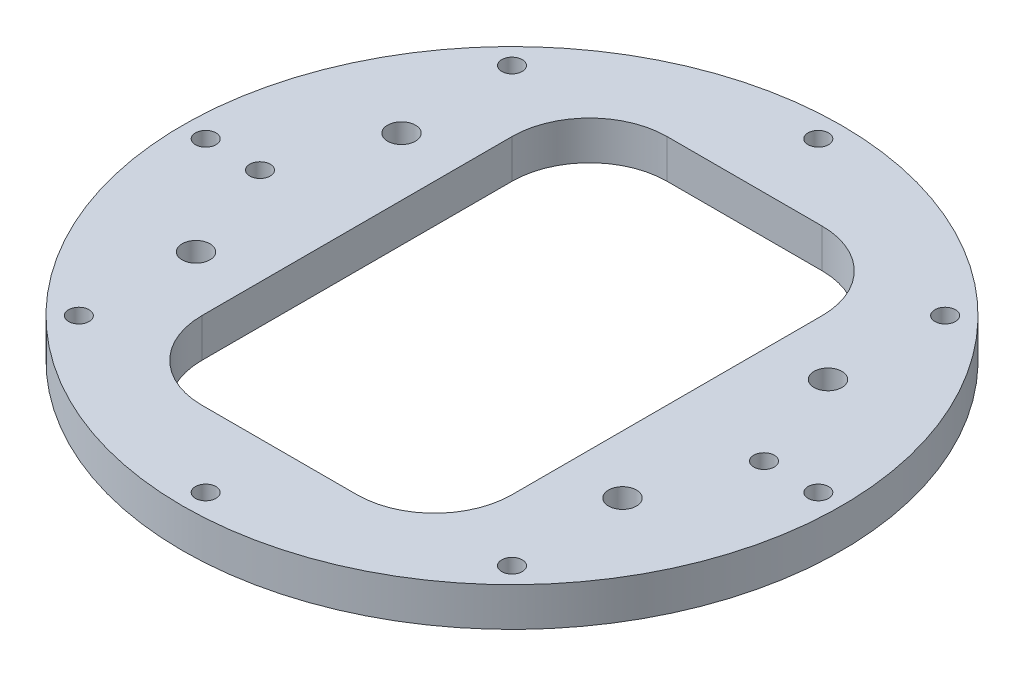
ISO-10303-21;
HEADER;
FILE_DESCRIPTION(('STEP AP214'),'2;1');
FILE_NAME('part.step','',(''),(''),'','','');
FILE_SCHEMA(('AUTOMOTIVE_DESIGN { 1 0 10303 214 1 1 1 1 }'));
ENDSEC;
DATA;
#1=APPLICATION_CONTEXT('core data for automotive mechanical design processes');
#2=APPLICATION_PROTOCOL_DEFINITION('international standard','automotive_design',2000,#1);
#3=PRODUCT_CONTEXT('',#1,'mechanical');
#4=PRODUCT('Part','Part','',(#3));
#5=PRODUCT_RELATED_PRODUCT_CATEGORY('part','',(#4));
#6=PRODUCT_DEFINITION_FORMATION('','',#4);
#7=PRODUCT_DEFINITION_CONTEXT('part definition',#1,'design');
#8=PRODUCT_DEFINITION('design','',#6,#7);
#9=PRODUCT_DEFINITION_SHAPE('','',#8);
#10=(LENGTH_UNIT() NAMED_UNIT(*) SI_UNIT(.MILLI.,.METRE.));
#11=(NAMED_UNIT(*) PLANE_ANGLE_UNIT() SI_UNIT($,.RADIAN.));
#12=(NAMED_UNIT(*) SI_UNIT($,.STERADIAN.) SOLID_ANGLE_UNIT());
#13=UNCERTAINTY_MEASURE_WITH_UNIT(LENGTH_MEASURE(1.E-05),#10,'distance_accuracy_value','');
#14=(GEOMETRIC_REPRESENTATION_CONTEXT(3) GLOBAL_UNCERTAINTY_ASSIGNED_CONTEXT((#13)) GLOBAL_UNIT_ASSIGNED_CONTEXT((#10,
#11,#12)) REPRESENTATION_CONTEXT('',''));
#15=CARTESIAN_POINT('',(0.,0.,0.));
#16=DIRECTION('',(0.,0.,1.));
#17=DIRECTION('',(1.,0.,0.));
#18=AXIS2_PLACEMENT_3D('',#15,#16,#17);
#19=CARTESIAN_POINT('',(0.,10.,0.));
#20=DIRECTION('',(0.,1.,0.));
#21=DIRECTION('',(0.,0.,1.));
#22=AXIS2_PLACEMENT_3D('',#19,#20,#21);
#23=PLANE('',#22);
#24=CARTESIAN_POINT('',(-55.,10.,26.5));
#25=DIRECTION('',(0.,1.,0.));
#26=DIRECTION('',(0.,0.,1.));
#27=AXIS2_PLACEMENT_3D('',#24,#25,#26);
#28=CIRCLE('',#27,3.6);
#29=CARTESIAN_POINT('',(-55.,10.,30.1));
#30=VERTEX_POINT('',#29);
#31=EDGE_CURVE('E273',#30,#30,#28,.T.);
#32=ORIENTED_EDGE('',*,*,#31,.F.);
#33=EDGE_LOOP('',(#32));
#34=FACE_BOUND('',#33,.T.);
#35=CARTESIAN_POINT('',(55.,10.,-26.5));
#36=DIRECTION('',(0.,1.,0.));
#37=DIRECTION('',(0.,0.,1.));
#38=AXIS2_PLACEMENT_3D('',#35,#36,#37);
#39=CIRCLE('',#38,3.6);
#40=CARTESIAN_POINT('',(55.,10.,-22.9));
#41=VERTEX_POINT('',#40);
#42=EDGE_CURVE('E297',#41,#41,#39,.T.);
#43=ORIENTED_EDGE('',*,*,#42,.F.);
#44=EDGE_LOOP('',(#43));
#45=FACE_BOUND('',#44,.T.);
#46=CARTESIAN_POINT('',(65.,10.,0.));
#47=DIRECTION('',(0.,1.,0.));
#48=DIRECTION('',(0.,0.,1.));
#49=AXIS2_PLACEMENT_3D('',#46,#47,#48);
#50=CIRCLE('',#49,2.65);
#51=CARTESIAN_POINT('',(65.,10.,2.65));
#52=VERTEX_POINT('',#51);
#53=EDGE_CURVE('E287',#52,#52,#50,.T.);
#54=ORIENTED_EDGE('',*,*,#53,.F.);
#55=EDGE_LOOP('',(#54));
#56=FACE_BOUND('',#55,.T.);
#57=CARTESIAN_POINT('',(55.8614357137374,10.,-55.8614357137372));
#58=DIRECTION('',(0.,1.,0.));
#59=DIRECTION('',(0.,0.,1.));
#60=AXIS2_PLACEMENT_3D('',#57,#58,#59);
#61=CIRCLE('',#60,2.65);
#62=CARTESIAN_POINT('',(55.8614357137374,10.,-53.2114357137371));
#63=VERTEX_POINT('',#62);
#64=EDGE_CURVE('E142',#63,#63,#61,.T.);
#65=ORIENTED_EDGE('',*,*,#64,.F.);
#66=EDGE_LOOP('',(#65));
#67=FACE_BOUND('',#66,.T.);
#68=CARTESIAN_POINT('',(79.,10.,2.75827025768607E-13));
#69=DIRECTION('',(0.,1.,0.));
#70=DIRECTION('',(0.,0.,1.));
#71=AXIS2_PLACEMENT_3D('',#68,#69,#70);
#72=CIRCLE('',#71,2.65);
#73=CARTESIAN_POINT('',(79.,10.,2.65000000000027));
#74=VERTEX_POINT('',#73);
#75=EDGE_CURVE('E235',#74,#74,#72,.T.);
#76=ORIENTED_EDGE('',*,*,#75,.F.);
#77=EDGE_LOOP('',(#76));
#78=FACE_BOUND('',#77,.T.);
#79=CARTESIAN_POINT('',(55.861435713737,10.,55.8614357137375));
#80=DIRECTION('',(0.,1.,0.));
#81=DIRECTION('',(0.,0.,1.));
#82=AXIS2_PLACEMENT_3D('',#79,#80,#81);
#83=CIRCLE('',#82,2.65);
#84=CARTESIAN_POINT('',(55.861435713737,10.,58.5114357137375));
#85=VERTEX_POINT('',#84);
#86=EDGE_CURVE('E232',#85,#85,#83,.T.);
#87=ORIENTED_EDGE('',*,*,#86,.F.);
#88=EDGE_LOOP('',(#87));
#89=FACE_BOUND('',#88,.T.);
#90=CARTESIAN_POINT('',(-5.51654051537215E-13,10.,79.));
#91=DIRECTION('',(0.,1.,0.));
#92=DIRECTION('',(0.,0.,1.));
#93=AXIS2_PLACEMENT_3D('',#90,#91,#92);
#94=CIRCLE('',#93,2.65);
#95=CARTESIAN_POINT('',(-5.51654051537215E-13,10.,81.65));
#96=VERTEX_POINT('',#95);
#97=EDGE_CURVE('E229',#96,#96,#94,.T.);
#98=ORIENTED_EDGE('',*,*,#97,.F.);
#99=EDGE_LOOP('',(#98));
#100=FACE_BOUND('',#99,.T.);
#101=CARTESIAN_POINT('',(-55.8614357137377,10.,55.8614357137368));
#102=DIRECTION('',(0.,1.,0.));
#103=DIRECTION('',(0.,0.,1.));
#104=AXIS2_PLACEMENT_3D('',#101,#102,#103);
#105=CIRCLE('',#104,2.65);
#106=CARTESIAN_POINT('',(-55.8614357137377,10.,58.5114357137368));
#107=VERTEX_POINT('',#106);
#108=EDGE_CURVE('E226',#107,#107,#105,.T.);
#109=ORIENTED_EDGE('',*,*,#108,.F.);
#110=EDGE_LOOP('',(#109));
#111=FACE_BOUND('',#110,.T.);
#112=CARTESIAN_POINT('',(-79.,10.,-8.27481077305822E-13));
#113=DIRECTION('',(0.,1.,0.));
#114=DIRECTION('',(0.,0.,1.));
#115=AXIS2_PLACEMENT_3D('',#112,#113,#114);
#116=CIRCLE('',#115,2.65);
#117=CARTESIAN_POINT('',(-79.,10.,2.64999999999917));
#118=VERTEX_POINT('',#117);
#119=EDGE_CURVE('E223',#118,#118,#116,.T.);
#120=ORIENTED_EDGE('',*,*,#119,.F.);
#121=EDGE_LOOP('',(#120));
#122=FACE_BOUND('',#121,.T.);
#123=CARTESIAN_POINT('',(-55.8614357137366,10.,-55.8614357137379));
#124=DIRECTION('',(0.,1.,0.));
#125=DIRECTION('',(0.,0.,1.));
#126=AXIS2_PLACEMENT_3D('',#123,#124,#125);
#127=CIRCLE('',#126,2.65);
#128=CARTESIAN_POINT('',(-55.8614357137366,10.,-53.2114357137379));
#129=VERTEX_POINT('',#128);
#130=EDGE_CURVE('E220',#129,#129,#127,.T.);
#131=ORIENTED_EDGE('',*,*,#130,.F.);
#132=EDGE_LOOP('',(#131));
#133=FACE_BOUND('',#132,.T.);
#134=CARTESIAN_POINT('',(0.,10.,-79.));
#135=DIRECTION('',(0.,1.,0.));
#136=DIRECTION('',(0.,0.,1.));
#137=AXIS2_PLACEMENT_3D('',#134,#135,#136);
#138=CIRCLE('',#137,2.65);
#139=CARTESIAN_POINT('',(0.,10.,-76.35));
#140=VERTEX_POINT('',#139);
#141=EDGE_CURVE('E212',#140,#140,#138,.T.);
#142=ORIENTED_EDGE('',*,*,#141,.F.);
#143=EDGE_LOOP('',(#142));
#144=FACE_BOUND('',#143,.T.);
#145=CARTESIAN_POINT('',(55.,10.,26.5));
#146=DIRECTION('',(0.,1.,0.));
#147=DIRECTION('',(0.,0.,1.));
#148=AXIS2_PLACEMENT_3D('',#145,#146,#147);
#149=CIRCLE('',#148,3.6);
#150=CARTESIAN_POINT('',(55.,10.,30.1));
#151=VERTEX_POINT('',#150);
#152=EDGE_CURVE('E264',#151,#151,#149,.F.);
#153=ORIENTED_EDGE('',*,*,#152,.T.);
#154=EDGE_LOOP('',(#153));
#155=FACE_BOUND('',#154,.T.);
#156=CARTESIAN_POINT('',(-55.,10.,-26.5));
#157=DIRECTION('',(0.,-1.,0.));
#158=DIRECTION('',(0.,0.,-1.));
#159=AXIS2_PLACEMENT_3D('',#156,#157,#158);
#160=CIRCLE('',#159,3.60000000000002);
#161=CARTESIAN_POINT('',(-55.,10.,-30.1));
#162=VERTEX_POINT('',#161);
#163=EDGE_CURVE('E268',#162,#162,#160,.T.);
#164=ORIENTED_EDGE('',*,*,#163,.T.);
#165=EDGE_LOOP('',(#164));
#166=FACE_BOUND('',#165,.T.);
#167=CARTESIAN_POINT('',(-65.,10.,4.44089209850063E-13));
#168=DIRECTION('',(0.,1.,0.));
#169=DIRECTION('',(0.,0.,1.));
#170=AXIS2_PLACEMENT_3D('',#167,#168,#169);
#171=CIRCLE('',#170,2.65);
#172=CARTESIAN_POINT('',(-65.,10.,2.65000000000044));
#173=VERTEX_POINT('',#172);
#174=EDGE_CURVE('E271',#173,#173,#171,.F.);
#175=ORIENTED_EDGE('',*,*,#174,.T.);
#176=EDGE_LOOP('',(#175));
#177=FACE_BOUND('',#176,.T.);
#178=DIRECTION('',(0.,0.,-1.));
#179=VECTOR('',#178,1.);
#180=CARTESIAN_POINT('',(40.,10.,0.));
#181=LINE('',#180,#179);
#182=CARTESIAN_POINT('',(40.,10.,40.));
#183=VERTEX_POINT('',#182);
#184=CARTESIAN_POINT('',(40.,10.,-40.));
#185=VERTEX_POINT('',#184);
#186=EDGE_CURVE('E208',#183,#185,#181,.T.);
#187=ORIENTED_EDGE('',*,*,#186,.F.);
#188=CARTESIAN_POINT('',(20.,10.,40.));
#189=DIRECTION('',(0.,1.,0.));
#190=DIRECTION('',(0.,0.,1.));
#191=AXIS2_PLACEMENT_3D('',#188,#189,#190);
#192=CIRCLE('',#191,20.);
#193=CARTESIAN_POINT('',(20.,10.,60.));
#194=VERTEX_POINT('',#193);
#195=EDGE_CURVE('E123',#183,#194,#192,.F.);
#196=ORIENTED_EDGE('',*,*,#195,.T.);
#197=DIRECTION('',(1.,0.,0.));
#198=VECTOR('',#197,1.);
#199=CARTESIAN_POINT('',(-40.,10.,60.));
#200=LINE('',#199,#198);
#201=CARTESIAN_POINT('',(-20.,10.,60.));
#202=VERTEX_POINT('',#201);
#203=EDGE_CURVE('E173',#202,#194,#200,.T.);
#204=ORIENTED_EDGE('',*,*,#203,.F.);
#205=CARTESIAN_POINT('',(-20.,10.,40.));
#206=DIRECTION('',(0.,1.,0.));
#207=DIRECTION('',(0.,0.,1.));
#208=AXIS2_PLACEMENT_3D('',#205,#206,#207);
#209=CIRCLE('',#208,20.);
#210=CARTESIAN_POINT('',(-40.,10.,40.));
#211=VERTEX_POINT('',#210);
#212=EDGE_CURVE('E122',#202,#211,#209,.F.);
#213=ORIENTED_EDGE('',*,*,#212,.T.);
#214=DIRECTION('',(0.,0.,-1.));
#215=VECTOR('',#214,1.);
#216=CARTESIAN_POINT('',(-40.,10.,0.));
#217=LINE('',#216,#215);
#218=CARTESIAN_POINT('',(-40.,10.,-40.));
#219=VERTEX_POINT('',#218);
#220=EDGE_CURVE('E168',#211,#219,#217,.T.);
#221=ORIENTED_EDGE('',*,*,#220,.T.);
#222=CARTESIAN_POINT('',(-20.,10.,-40.));
#223=DIRECTION('',(0.,1.,0.));
#224=DIRECTION('',(0.,0.,1.));
#225=AXIS2_PLACEMENT_3D('',#222,#223,#224);
#226=CIRCLE('',#225,20.);
#227=CARTESIAN_POINT('',(-20.,10.,-60.));
#228=VERTEX_POINT('',#227);
#229=EDGE_CURVE('E54',#219,#228,#226,.F.);
#230=ORIENTED_EDGE('',*,*,#229,.T.);
#231=DIRECTION('',(-1.,0.,0.));
#232=VECTOR('',#231,1.);
#233=CARTESIAN_POINT('',(-40.,10.,-60.));
#234=LINE('',#233,#232);
#235=CARTESIAN_POINT('',(20.,10.,-60.));
#236=VERTEX_POINT('',#235);
#237=EDGE_CURVE('E166',#236,#228,#234,.T.);
#238=ORIENTED_EDGE('',*,*,#237,.F.);
#239=CARTESIAN_POINT('',(20.,10.,-40.));
#240=DIRECTION('',(0.,1.,0.));
#241=DIRECTION('',(0.,0.,1.));
#242=AXIS2_PLACEMENT_3D('',#239,#240,#241);
#243=CIRCLE('',#242,20.);
#244=EDGE_CURVE('E160',#236,#185,#243,.F.);
#245=ORIENTED_EDGE('',*,*,#244,.T.);
#246=EDGE_LOOP('',(#187,#196,#204,#213,#221,#230,#238,#245));
#247=FACE_BOUND('',#246,.T.);
#248=CARTESIAN_POINT('',(0.,10.,0.));
#249=DIRECTION('',(0.,1.,0.));
#250=DIRECTION('',(0.,0.,1.));
#251=AXIS2_PLACEMENT_3D('',#248,#249,#250);
#252=CIRCLE('',#251,85.);
#253=CARTESIAN_POINT('',(0.,10.,85.));
#254=VERTEX_POINT('',#253);
#255=EDGE_CURVE('E380',#254,#254,#252,.T.);
#256=ORIENTED_EDGE('',*,*,#255,.T.);
#257=EDGE_LOOP('',(#256));
#258=FACE_BOUND('',#257,.T.);
#259=ADVANCED_FACE('F46',(#34,#45,#56,#67,#78,#89,#100,#111,#122,#133,#144,#155,#166,#177,#247,
#258),#23,.T.);
#260=CARTESIAN_POINT('',(0.,0.,0.));
#261=DIRECTION('',(0.,1.,0.));
#262=DIRECTION('',(0.,0.,1.));
#263=AXIS2_PLACEMENT_3D('',#260,#261,#262);
#264=PLANE('',#263);
#265=CARTESIAN_POINT('',(-55.,0.,26.5));
#266=DIRECTION('',(0.,1.,0.));
#267=DIRECTION('',(0.,0.,1.));
#268=AXIS2_PLACEMENT_3D('',#265,#266,#267);
#269=CIRCLE('',#268,3.6);
#270=CARTESIAN_POINT('',(-55.,0.,30.1));
#271=VERTEX_POINT('',#270);
#272=EDGE_CURVE('E278',#271,#271,#269,.T.);
#273=ORIENTED_EDGE('',*,*,#272,.T.);
#274=EDGE_LOOP('',(#273));
#275=FACE_BOUND('',#274,.T.);
#276=CARTESIAN_POINT('',(65.,0.,0.));
#277=DIRECTION('',(0.,1.,0.));
#278=DIRECTION('',(0.,0.,1.));
#279=AXIS2_PLACEMENT_3D('',#276,#277,#278);
#280=CIRCLE('',#279,2.65);
#281=CARTESIAN_POINT('',(65.,0.,2.65));
#282=VERTEX_POINT('',#281);
#283=EDGE_CURVE('E290',#282,#282,#280,.T.);
#284=ORIENTED_EDGE('',*,*,#283,.T.);
#285=EDGE_LOOP('',(#284));
#286=FACE_BOUND('',#285,.T.);
#287=CARTESIAN_POINT('',(55.,0.,26.5));
#288=DIRECTION('',(0.,1.,0.));
#289=DIRECTION('',(0.,0.,1.));
#290=AXIS2_PLACEMENT_3D('',#287,#288,#289);
#291=CIRCLE('',#290,3.6);
#292=CARTESIAN_POINT('',(55.,0.,30.1));
#293=VERTEX_POINT('',#292);
#294=EDGE_CURVE('E283',#293,#293,#291,.F.);
#295=ORIENTED_EDGE('',*,*,#294,.F.);
#296=EDGE_LOOP('',(#295));
#297=FACE_BOUND('',#296,.T.);
#298=CARTESIAN_POINT('',(0.,0.,-79.));
#299=DIRECTION('',(0.,1.,0.));
#300=DIRECTION('',(0.,0.,1.));
#301=AXIS2_PLACEMENT_3D('',#298,#299,#300);
#302=CIRCLE('',#301,2.65);
#303=CARTESIAN_POINT('',(0.,0.,-76.35));
#304=VERTEX_POINT('',#303);
#305=EDGE_CURVE('E183',#304,#304,#302,.T.);
#306=ORIENTED_EDGE('',*,*,#305,.T.);
#307=EDGE_LOOP('',(#306));
#308=FACE_BOUND('',#307,.T.);
#309=CARTESIAN_POINT('',(-55.8614357137366,0.,-55.8614357137379));
#310=DIRECTION('',(0.,1.,0.));
#311=DIRECTION('',(0.,0.,1.));
#312=AXIS2_PLACEMENT_3D('',#309,#310,#311);
#313=CIRCLE('',#312,2.65);
#314=CARTESIAN_POINT('',(-55.8614357137366,0.,-53.2114357137379));
#315=VERTEX_POINT('',#314);
#316=EDGE_CURVE('E186',#315,#315,#313,.T.);
#317=ORIENTED_EDGE('',*,*,#316,.T.);
#318=EDGE_LOOP('',(#317));
#319=FACE_BOUND('',#318,.T.);
#320=CARTESIAN_POINT('',(-79.,0.,-8.27481077305822E-13));
#321=DIRECTION('',(0.,1.,0.));
#322=DIRECTION('',(0.,0.,1.));
#323=AXIS2_PLACEMENT_3D('',#320,#321,#322);
#324=CIRCLE('',#323,2.65);
#325=CARTESIAN_POINT('',(-79.,0.,2.64999999999917));
#326=VERTEX_POINT('',#325);
#327=EDGE_CURVE('E192',#326,#326,#324,.T.);
#328=ORIENTED_EDGE('',*,*,#327,.T.);
#329=EDGE_LOOP('',(#328));
#330=FACE_BOUND('',#329,.T.);
#331=CARTESIAN_POINT('',(-55.8614357137377,0.,55.8614357137368));
#332=DIRECTION('',(0.,1.,0.));
#333=DIRECTION('',(0.,0.,1.));
#334=AXIS2_PLACEMENT_3D('',#331,#332,#333);
#335=CIRCLE('',#334,2.65);
#336=CARTESIAN_POINT('',(-55.8614357137377,0.,58.5114357137368));
#337=VERTEX_POINT('',#336);
#338=EDGE_CURVE('E195',#337,#337,#335,.T.);
#339=ORIENTED_EDGE('',*,*,#338,.T.);
#340=EDGE_LOOP('',(#339));
#341=FACE_BOUND('',#340,.T.);
#342=CARTESIAN_POINT('',(-5.51654051537215E-13,0.,79.));
#343=DIRECTION('',(0.,1.,0.));
#344=DIRECTION('',(0.,0.,1.));
#345=AXIS2_PLACEMENT_3D('',#342,#343,#344);
#346=CIRCLE('',#345,2.65);
#347=CARTESIAN_POINT('',(-5.51654051537215E-13,0.,81.65));
#348=VERTEX_POINT('',#347);
#349=EDGE_CURVE('E198',#348,#348,#346,.T.);
#350=ORIENTED_EDGE('',*,*,#349,.T.);
#351=EDGE_LOOP('',(#350));
#352=FACE_BOUND('',#351,.T.);
#353=CARTESIAN_POINT('',(55.861435713737,0.,55.8614357137375));
#354=DIRECTION('',(0.,1.,0.));
#355=DIRECTION('',(0.,0.,1.));
#356=AXIS2_PLACEMENT_3D('',#353,#354,#355);
#357=CIRCLE('',#356,2.65);
#358=CARTESIAN_POINT('',(55.861435713737,0.,58.5114357137375));
#359=VERTEX_POINT('',#358);
#360=EDGE_CURVE('E201',#359,#359,#357,.T.);
#361=ORIENTED_EDGE('',*,*,#360,.T.);
#362=EDGE_LOOP('',(#361));
#363=FACE_BOUND('',#362,.T.);
#364=CARTESIAN_POINT('',(79.,0.,2.75827025768607E-13));
#365=DIRECTION('',(0.,1.,0.));
#366=DIRECTION('',(0.,0.,1.));
#367=AXIS2_PLACEMENT_3D('',#364,#365,#366);
#368=CIRCLE('',#367,2.65);
#369=CARTESIAN_POINT('',(79.,0.,2.65000000000027));
#370=VERTEX_POINT('',#369);
#371=EDGE_CURVE('E204',#370,#370,#368,.T.);
#372=ORIENTED_EDGE('',*,*,#371,.T.);
#373=EDGE_LOOP('',(#372));
#374=FACE_BOUND('',#373,.T.);
#375=CARTESIAN_POINT('',(55.8614357137374,0.,-55.8614357137372));
#376=DIRECTION('',(0.,1.,0.));
#377=DIRECTION('',(0.,0.,1.));
#378=AXIS2_PLACEMENT_3D('',#375,#376,#377);
#379=CIRCLE('',#378,2.65);
#380=CARTESIAN_POINT('',(55.8614357137374,0.,-53.2114357137371));
#381=VERTEX_POINT('',#380);
#382=EDGE_CURVE('E206',#381,#381,#379,.T.);
#383=ORIENTED_EDGE('',*,*,#382,.T.);
#384=EDGE_LOOP('',(#383));
#385=FACE_BOUND('',#384,.T.);
#386=CARTESIAN_POINT('',(55.,0.,-26.5));
#387=DIRECTION('',(0.,1.,0.));
#388=DIRECTION('',(0.,0.,1.));
#389=AXIS2_PLACEMENT_3D('',#386,#387,#388);
#390=CIRCLE('',#389,3.6);
#391=CARTESIAN_POINT('',(55.,0.,-22.9));
#392=VERTEX_POINT('',#391);
#393=EDGE_CURVE('E215',#392,#392,#390,.T.);
#394=ORIENTED_EDGE('',*,*,#393,.T.);
#395=EDGE_LOOP('',(#394));
#396=FACE_BOUND('',#395,.T.);
#397=CARTESIAN_POINT('',(-55.,0.,-26.5));
#398=DIRECTION('',(0.,-1.,0.));
#399=DIRECTION('',(0.,0.,-1.));
#400=AXIS2_PLACEMENT_3D('',#397,#398,#399);
#401=CIRCLE('',#400,3.60000000000002);
#402=CARTESIAN_POINT('',(-55.,0.,-30.1));
#403=VERTEX_POINT('',#402);
#404=EDGE_CURVE('E284',#403,#403,#401,.T.);
#405=ORIENTED_EDGE('',*,*,#404,.F.);
#406=EDGE_LOOP('',(#405));
#407=FACE_BOUND('',#406,.T.);
#408=CARTESIAN_POINT('',(-65.,0.,4.44089209850063E-13));
#409=DIRECTION('',(0.,1.,0.));
#410=DIRECTION('',(0.,0.,1.));
#411=AXIS2_PLACEMENT_3D('',#408,#409,#410);
#412=CIRCLE('',#411,2.65);
#413=CARTESIAN_POINT('',(-65.,0.,2.65000000000044));
#414=VERTEX_POINT('',#413);
#415=EDGE_CURVE('E134',#414,#414,#412,.F.);
#416=ORIENTED_EDGE('',*,*,#415,.F.);
#417=EDGE_LOOP('',(#416));
#418=FACE_BOUND('',#417,.T.);
#419=DIRECTION('',(0.,0.,-1.));
#420=VECTOR('',#419,1.);
#421=CARTESIAN_POINT('',(-40.,0.,0.));
#422=LINE('',#421,#420);
#423=CARTESIAN_POINT('',(-40.,0.,40.));
#424=VERTEX_POINT('',#423);
#425=CARTESIAN_POINT('',(-40.,0.,-40.));
#426=VERTEX_POINT('',#425);
#427=EDGE_CURVE('E133',#424,#426,#422,.T.);
#428=ORIENTED_EDGE('',*,*,#427,.F.);
#429=CARTESIAN_POINT('',(-20.,0.,40.));
#430=DIRECTION('',(0.,1.,0.));
#431=DIRECTION('',(0.,0.,1.));
#432=AXIS2_PLACEMENT_3D('',#429,#430,#431);
#433=CIRCLE('',#432,20.);
#434=CARTESIAN_POINT('',(-20.,0.,60.));
#435=VERTEX_POINT('',#434);
#436=EDGE_CURVE('E158',#424,#435,#433,.T.);
#437=ORIENTED_EDGE('',*,*,#436,.T.);
#438=DIRECTION('',(1.,0.,0.));
#439=VECTOR('',#438,1.);
#440=CARTESIAN_POINT('',(-40.,0.,60.));
#441=LINE('',#440,#439);
#442=CARTESIAN_POINT('',(20.,0.,60.));
#443=VERTEX_POINT('',#442);
#444=EDGE_CURVE('E118',#435,#443,#441,.T.);
#445=ORIENTED_EDGE('',*,*,#444,.T.);
#446=CARTESIAN_POINT('',(20.,0.,40.));
#447=DIRECTION('',(0.,1.,0.));
#448=DIRECTION('',(0.,0.,1.));
#449=AXIS2_PLACEMENT_3D('',#446,#447,#448);
#450=CIRCLE('',#449,20.);
#451=CARTESIAN_POINT('',(40.,0.,40.));
#452=VERTEX_POINT('',#451);
#453=EDGE_CURVE('E111',#443,#452,#450,.T.);
#454=ORIENTED_EDGE('',*,*,#453,.T.);
#455=DIRECTION('',(0.,0.,-1.));
#456=VECTOR('',#455,1.);
#457=CARTESIAN_POINT('',(40.,0.,0.));
#458=LINE('',#457,#456);
#459=CARTESIAN_POINT('',(40.,0.,-40.));
#460=VERTEX_POINT('',#459);
#461=EDGE_CURVE('E116',#452,#460,#458,.T.);
#462=ORIENTED_EDGE('',*,*,#461,.T.);
#463=CARTESIAN_POINT('',(20.,0.,-40.));
#464=DIRECTION('',(0.,1.,0.));
#465=DIRECTION('',(0.,0.,1.));
#466=AXIS2_PLACEMENT_3D('',#463,#464,#465);
#467=CIRCLE('',#466,20.);
#468=CARTESIAN_POINT('',(20.,0.,-60.));
#469=VERTEX_POINT('',#468);
#470=EDGE_CURVE('E68',#460,#469,#467,.T.);
#471=ORIENTED_EDGE('',*,*,#470,.T.);
#472=DIRECTION('',(-1.,0.,0.));
#473=VECTOR('',#472,1.);
#474=CARTESIAN_POINT('',(-40.,0.,-60.));
#475=LINE('',#474,#473);
#476=CARTESIAN_POINT('',(-20.,0.,-60.));
#477=VERTEX_POINT('',#476);
#478=EDGE_CURVE('E179',#469,#477,#475,.T.);
#479=ORIENTED_EDGE('',*,*,#478,.T.);
#480=CARTESIAN_POINT('',(-20.,0.,-40.));
#481=DIRECTION('',(0.,1.,0.));
#482=DIRECTION('',(0.,0.,1.));
#483=AXIS2_PLACEMENT_3D('',#480,#481,#482);
#484=CIRCLE('',#483,20.);
#485=EDGE_CURVE('E11',#477,#426,#484,.T.);
#486=ORIENTED_EDGE('',*,*,#485,.T.);
#487=EDGE_LOOP('',(#428,#437,#445,#454,#462,#471,#479,#486));
#488=FACE_BOUND('',#487,.T.);
#489=CARTESIAN_POINT('',(0.,0.,0.));
#490=DIRECTION('',(0.,1.,0.));
#491=DIRECTION('',(0.,0.,1.));
#492=AXIS2_PLACEMENT_3D('',#489,#490,#491);
#493=CIRCLE('',#492,85.);
#494=CARTESIAN_POINT('',(0.,0.,85.));
#495=VERTEX_POINT('',#494);
#496=EDGE_CURVE('E174',#495,#495,#493,.T.);
#497=ORIENTED_EDGE('',*,*,#496,.F.);
#498=EDGE_LOOP('',(#497));
#499=FACE_BOUND('',#498,.T.);
#500=ADVANCED_FACE('F114',(#275,#286,#297,#308,#319,#330,#341,#352,#363,#374,#385,#396,#407,
#418,#488,#499),#264,.F.);
#501=CARTESIAN_POINT('',(40.,10.,0.));
#502=DIRECTION('',(-1.,0.,0.));
#503=DIRECTION('',(0.,0.,1.));
#504=AXIS2_PLACEMENT_3D('',#501,#502,#503);
#505=PLANE('',#504);
#506=ORIENTED_EDGE('',*,*,#461,.F.);
#507=DIRECTION('',(0.,1.,0.));
#508=VECTOR('',#507,1.);
#509=CARTESIAN_POINT('',(40.,10.,40.));
#510=LINE('',#509,#508);
#511=EDGE_CURVE('E129',#452,#183,#510,.T.);
#512=ORIENTED_EDGE('',*,*,#511,.T.);
#513=ORIENTED_EDGE('',*,*,#186,.T.);
#514=DIRECTION('',(0.,1.,0.));
#515=VECTOR('',#514,1.);
#516=CARTESIAN_POINT('',(40.,10.,-40.));
#517=LINE('',#516,#515);
#518=EDGE_CURVE('E132',#185,#460,#517,.F.);
#519=ORIENTED_EDGE('',*,*,#518,.T.);
#520=EDGE_LOOP('',(#506,#512,#513,#519));
#521=FACE_BOUND('',#520,.T.);
#522=ADVANCED_FACE('F127',(#521),#505,.T.);
#523=CARTESIAN_POINT('',(-40.,10.,0.));
#524=DIRECTION('',(-1.,0.,0.));
#525=DIRECTION('',(0.,0.,1.));
#526=AXIS2_PLACEMENT_3D('',#523,#524,#525);
#527=PLANE('',#526);
#528=ORIENTED_EDGE('',*,*,#220,.F.);
#529=DIRECTION('',(0.,1.,0.));
#530=VECTOR('',#529,1.);
#531=CARTESIAN_POINT('',(-40.,0.,40.));
#532=LINE('',#531,#530);
#533=EDGE_CURVE('E150',#211,#424,#532,.F.);
#534=ORIENTED_EDGE('',*,*,#533,.T.);
#535=ORIENTED_EDGE('',*,*,#427,.T.);
#536=DIRECTION('',(0.,1.,0.));
#537=VECTOR('',#536,1.);
#538=CARTESIAN_POINT('',(-40.,10.,-40.));
#539=LINE('',#538,#537);
#540=EDGE_CURVE('E147',#426,#219,#539,.T.);
#541=ORIENTED_EDGE('',*,*,#540,.T.);
#542=EDGE_LOOP('',(#528,#534,#535,#541));
#543=FACE_BOUND('',#542,.T.);
#544=ADVANCED_FACE('F181',(#543),#527,.F.);
#545=CARTESIAN_POINT('',(55.8614357137374,10.,-55.8614357137372));
#546=DIRECTION('',(0.,-1.,0.));
#547=DIRECTION('',(0.,0.,-1.));
#548=AXIS2_PLACEMENT_3D('',#545,#546,#547);
#549=CYLINDRICAL_SURFACE('',#548,2.65);
#550=ORIENTED_EDGE('',*,*,#64,.T.);
#551=EDGE_LOOP('',(#550));
#552=FACE_BOUND('',#551,.T.);
#553=ORIENTED_EDGE('',*,*,#382,.F.);
#554=EDGE_LOOP('',(#553));
#555=FACE_BOUND('',#554,.T.);
#556=ADVANCED_FACE('F240',(#552,#555),#549,.F.);
#557=CARTESIAN_POINT('',(79.,10.,2.75827025768607E-13));
#558=DIRECTION('',(0.,-1.,0.));
#559=DIRECTION('',(0.,0.,-1.));
#560=AXIS2_PLACEMENT_3D('',#557,#558,#559);
#561=CYLINDRICAL_SURFACE('',#560,2.65);
#562=ORIENTED_EDGE('',*,*,#75,.T.);
#563=EDGE_LOOP('',(#562));
#564=FACE_BOUND('',#563,.T.);
#565=ORIENTED_EDGE('',*,*,#371,.F.);
#566=EDGE_LOOP('',(#565));
#567=FACE_BOUND('',#566,.T.);
#568=ADVANCED_FACE('F328',(#564,#567),#561,.F.);
#569=CARTESIAN_POINT('',(55.861435713737,10.,55.8614357137375));
#570=DIRECTION('',(0.,-1.,0.));
#571=DIRECTION('',(0.,0.,-1.));
#572=AXIS2_PLACEMENT_3D('',#569,#570,#571);
#573=CYLINDRICAL_SURFACE('',#572,2.65);
#574=ORIENTED_EDGE('',*,*,#86,.T.);
#575=EDGE_LOOP('',(#574));
#576=FACE_BOUND('',#575,.T.);
#577=ORIENTED_EDGE('',*,*,#360,.F.);
#578=EDGE_LOOP('',(#577));
#579=FACE_BOUND('',#578,.T.);
#580=ADVANCED_FACE('F331',(#576,#579),#573,.F.);
#581=CARTESIAN_POINT('',(-5.51654051537215E-13,10.,79.));
#582=DIRECTION('',(0.,-1.,0.));
#583=DIRECTION('',(0.,0.,-1.));
#584=AXIS2_PLACEMENT_3D('',#581,#582,#583);
#585=CYLINDRICAL_SURFACE('',#584,2.65);
#586=ORIENTED_EDGE('',*,*,#97,.T.);
#587=EDGE_LOOP('',(#586));
#588=FACE_BOUND('',#587,.T.);
#589=ORIENTED_EDGE('',*,*,#349,.F.);
#590=EDGE_LOOP('',(#589));
#591=FACE_BOUND('',#590,.T.);
#592=ADVANCED_FACE('F335',(#588,#591),#585,.F.);
#593=CARTESIAN_POINT('',(-55.8614357137377,10.,55.8614357137368));
#594=DIRECTION('',(0.,-1.,0.));
#595=DIRECTION('',(0.,0.,-1.));
#596=AXIS2_PLACEMENT_3D('',#593,#594,#595);
#597=CYLINDRICAL_SURFACE('',#596,2.65);
#598=ORIENTED_EDGE('',*,*,#108,.T.);
#599=EDGE_LOOP('',(#598));
#600=FACE_BOUND('',#599,.T.);
#601=ORIENTED_EDGE('',*,*,#338,.F.);
#602=EDGE_LOOP('',(#601));
#603=FACE_BOUND('',#602,.T.);
#604=ADVANCED_FACE('F339',(#600,#603),#597,.F.);
#605=CARTESIAN_POINT('',(-79.,10.,-8.27481077305822E-13));
#606=DIRECTION('',(0.,-1.,0.));
#607=DIRECTION('',(0.,0.,-1.));
#608=AXIS2_PLACEMENT_3D('',#605,#606,#607);
#609=CYLINDRICAL_SURFACE('',#608,2.65);
#610=ORIENTED_EDGE('',*,*,#119,.T.);
#611=EDGE_LOOP('',(#610));
#612=FACE_BOUND('',#611,.T.);
#613=ORIENTED_EDGE('',*,*,#327,.F.);
#614=EDGE_LOOP('',(#613));
#615=FACE_BOUND('',#614,.T.);
#616=ADVANCED_FACE('F343',(#612,#615),#609,.F.);
#617=CARTESIAN_POINT('',(-55.8614357137366,10.,-55.8614357137379));
#618=DIRECTION('',(0.,-1.,0.));
#619=DIRECTION('',(0.,0.,-1.));
#620=AXIS2_PLACEMENT_3D('',#617,#618,#619);
#621=CYLINDRICAL_SURFACE('',#620,2.65);
#622=ORIENTED_EDGE('',*,*,#130,.T.);
#623=EDGE_LOOP('',(#622));
#624=FACE_BOUND('',#623,.T.);
#625=ORIENTED_EDGE('',*,*,#316,.F.);
#626=EDGE_LOOP('',(#625));
#627=FACE_BOUND('',#626,.T.);
#628=ADVANCED_FACE('F347',(#624,#627),#621,.F.);
#629=CARTESIAN_POINT('',(0.,10.,-79.));
#630=DIRECTION('',(0.,-1.,0.));
#631=DIRECTION('',(0.,0.,-1.));
#632=AXIS2_PLACEMENT_3D('',#629,#630,#631);
#633=CYLINDRICAL_SURFACE('',#632,2.65);
#634=ORIENTED_EDGE('',*,*,#141,.T.);
#635=EDGE_LOOP('',(#634));
#636=FACE_BOUND('',#635,.T.);
#637=ORIENTED_EDGE('',*,*,#305,.F.);
#638=EDGE_LOOP('',(#637));
#639=FACE_BOUND('',#638,.T.);
#640=ADVANCED_FACE('F351',(#636,#639),#633,.F.);
#641=CARTESIAN_POINT('',(55.,0.,26.5));
#642=DIRECTION('',(0.,1.,0.));
#643=DIRECTION('',(0.,0.,1.));
#644=AXIS2_PLACEMENT_3D('',#641,#642,#643);
#645=CYLINDRICAL_SURFACE('',#644,3.6);
#646=ORIENTED_EDGE('',*,*,#294,.T.);
#647=EDGE_LOOP('',(#646));
#648=FACE_BOUND('',#647,.T.);
#649=ORIENTED_EDGE('',*,*,#152,.F.);
#650=EDGE_LOOP('',(#649));
#651=FACE_BOUND('',#650,.T.);
#652=ADVANCED_FACE('F318',(#648,#651),#645,.F.);
#653=CARTESIAN_POINT('',(65.,0.,0.));
#654=DIRECTION('',(0.,1.,0.));
#655=DIRECTION('',(0.,0.,1.));
#656=AXIS2_PLACEMENT_3D('',#653,#654,#655);
#657=CYLINDRICAL_SURFACE('',#656,2.65);
#658=ORIENTED_EDGE('',*,*,#283,.F.);
#659=EDGE_LOOP('',(#658));
#660=FACE_BOUND('',#659,.T.);
#661=ORIENTED_EDGE('',*,*,#53,.T.);
#662=EDGE_LOOP('',(#661));
#663=FACE_BOUND('',#662,.T.);
#664=ADVANCED_FACE('F309',(#660,#663),#657,.F.);
#665=CARTESIAN_POINT('',(55.,0.,-26.5));
#666=DIRECTION('',(0.,1.,0.));
#667=DIRECTION('',(0.,0.,1.));
#668=AXIS2_PLACEMENT_3D('',#665,#666,#667);
#669=CYLINDRICAL_SURFACE('',#668,3.6);
#670=ORIENTED_EDGE('',*,*,#393,.F.);
#671=EDGE_LOOP('',(#670));
#672=FACE_BOUND('',#671,.T.);
#673=ORIENTED_EDGE('',*,*,#42,.T.);
#674=EDGE_LOOP('',(#673));
#675=FACE_BOUND('',#674,.T.);
#676=ADVANCED_FACE('F306',(#672,#675),#669,.F.);
#677=CARTESIAN_POINT('',(-55.,0.,26.5));
#678=DIRECTION('',(0.,1.,0.));
#679=DIRECTION('',(0.,0.,1.));
#680=AXIS2_PLACEMENT_3D('',#677,#678,#679);
#681=CYLINDRICAL_SURFACE('',#680,3.6);
#682=ORIENTED_EDGE('',*,*,#272,.F.);
#683=EDGE_LOOP('',(#682));
#684=FACE_BOUND('',#683,.T.);
#685=ORIENTED_EDGE('',*,*,#31,.T.);
#686=EDGE_LOOP('',(#685));
#687=FACE_BOUND('',#686,.T.);
#688=ADVANCED_FACE('F308',(#684,#687),#681,.F.);
#689=CARTESIAN_POINT('',(-55.,0.,-26.5));
#690=DIRECTION('',(0.,1.,0.));
#691=DIRECTION('',(0.,0.,1.));
#692=AXIS2_PLACEMENT_3D('',#689,#690,#691);
#693=CYLINDRICAL_SURFACE('',#692,3.60000000000002);
#694=ORIENTED_EDGE('',*,*,#404,.T.);
#695=EDGE_LOOP('',(#694));
#696=FACE_BOUND('',#695,.T.);
#697=ORIENTED_EDGE('',*,*,#163,.F.);
#698=EDGE_LOOP('',(#697));
#699=FACE_BOUND('',#698,.T.);
#700=ADVANCED_FACE('F315',(#696,#699),#693,.F.);
#701=CARTESIAN_POINT('',(-65.,0.,4.44089209850063E-13));
#702=DIRECTION('',(0.,1.,0.));
#703=DIRECTION('',(0.,0.,1.));
#704=AXIS2_PLACEMENT_3D('',#701,#702,#703);
#705=CYLINDRICAL_SURFACE('',#704,2.65);
#706=ORIENTED_EDGE('',*,*,#415,.T.);
#707=EDGE_LOOP('',(#706));
#708=FACE_BOUND('',#707,.T.);
#709=ORIENTED_EDGE('',*,*,#174,.F.);
#710=EDGE_LOOP('',(#709));
#711=FACE_BOUND('',#710,.T.);
#712=ADVANCED_FACE('F397',(#708,#711),#705,.F.);
#713=CARTESIAN_POINT('',(-40.,0.,-60.));
#714=DIRECTION('',(0.,0.,-1.));
#715=DIRECTION('',(-1.,0.,0.));
#716=AXIS2_PLACEMENT_3D('',#713,#714,#715);
#717=PLANE('',#716);
#718=ORIENTED_EDGE('',*,*,#478,.F.);
#719=DIRECTION('',(0.,1.,0.));
#720=VECTOR('',#719,1.);
#721=CARTESIAN_POINT('',(20.,0.,-60.));
#722=LINE('',#721,#720);
#723=EDGE_CURVE('E153',#469,#236,#722,.T.);
#724=ORIENTED_EDGE('',*,*,#723,.T.);
#725=ORIENTED_EDGE('',*,*,#237,.T.);
#726=DIRECTION('',(0.,1.,0.));
#727=VECTOR('',#726,1.);
#728=CARTESIAN_POINT('',(-20.,0.,-60.));
#729=LINE('',#728,#727);
#730=EDGE_CURVE('E61',#228,#477,#729,.F.);
#731=ORIENTED_EDGE('',*,*,#730,.T.);
#732=EDGE_LOOP('',(#718,#724,#725,#731));
#733=FACE_BOUND('',#732,.T.);
#734=ADVANCED_FACE('F171',(#733),#717,.F.);
#735=CARTESIAN_POINT('',(-40.,0.,60.));
#736=DIRECTION('',(0.,0.,1.));
#737=DIRECTION('',(1.,0.,0.));
#738=AXIS2_PLACEMENT_3D('',#735,#736,#737);
#739=PLANE('',#738);
#740=ORIENTED_EDGE('',*,*,#203,.T.);
#741=DIRECTION('',(0.,1.,0.));
#742=VECTOR('',#741,1.);
#743=CARTESIAN_POINT('',(20.,0.,60.));
#744=LINE('',#743,#742);
#745=EDGE_CURVE('E140',#194,#443,#744,.F.);
#746=ORIENTED_EDGE('',*,*,#745,.T.);
#747=ORIENTED_EDGE('',*,*,#444,.F.);
#748=DIRECTION('',(0.,1.,0.));
#749=VECTOR('',#748,1.);
#750=CARTESIAN_POINT('',(-20.,10.,60.));
#751=LINE('',#750,#749);
#752=EDGE_CURVE('E137',#435,#202,#751,.T.);
#753=ORIENTED_EDGE('',*,*,#752,.T.);
#754=EDGE_LOOP('',(#740,#746,#747,#753));
#755=FACE_BOUND('',#754,.T.);
#756=ADVANCED_FACE('F363',(#755),#739,.F.);
#757=CARTESIAN_POINT('',(20.,10.,40.));
#758=DIRECTION('',(0.,1.,0.));
#759=DIRECTION('',(0.,0.,1.));
#760=AXIS2_PLACEMENT_3D('',#757,#758,#759);
#761=CYLINDRICAL_SURFACE('',#760,20.);
#762=ORIENTED_EDGE('',*,*,#453,.F.);
#763=ORIENTED_EDGE('',*,*,#745,.F.);
#764=ORIENTED_EDGE('',*,*,#195,.F.);
#765=ORIENTED_EDGE('',*,*,#511,.F.);
#766=EDGE_LOOP('',(#762,#763,#764,#765));
#767=FACE_BOUND('',#766,.T.);
#768=ADVANCED_FACE('F136',(#767),#761,.F.);
#769=CARTESIAN_POINT('',(-20.,0.,40.));
#770=DIRECTION('',(0.,-1.,0.));
#771=DIRECTION('',(0.,0.,-1.));
#772=AXIS2_PLACEMENT_3D('',#769,#770,#771);
#773=CYLINDRICAL_SURFACE('',#772,20.);
#774=ORIENTED_EDGE('',*,*,#436,.F.);
#775=ORIENTED_EDGE('',*,*,#533,.F.);
#776=ORIENTED_EDGE('',*,*,#212,.F.);
#777=ORIENTED_EDGE('',*,*,#752,.F.);
#778=EDGE_LOOP('',(#774,#775,#776,#777));
#779=FACE_BOUND('',#778,.T.);
#780=ADVANCED_FACE('F362',(#779),#773,.F.);
#781=CARTESIAN_POINT('',(20.,0.,-40.));
#782=DIRECTION('',(0.,1.,0.));
#783=DIRECTION('',(0.,0.,1.));
#784=AXIS2_PLACEMENT_3D('',#781,#782,#783);
#785=CYLINDRICAL_SURFACE('',#784,20.);
#786=ORIENTED_EDGE('',*,*,#470,.F.);
#787=ORIENTED_EDGE('',*,*,#518,.F.);
#788=ORIENTED_EDGE('',*,*,#244,.F.);
#789=ORIENTED_EDGE('',*,*,#723,.F.);
#790=EDGE_LOOP('',(#786,#787,#788,#789));
#791=FACE_BOUND('',#790,.T.);
#792=ADVANCED_FACE('F365',(#791),#785,.F.);
#793=CARTESIAN_POINT('',(-20.,10.,-40.));
#794=DIRECTION('',(0.,-1.,0.));
#795=DIRECTION('',(0.,0.,-1.));
#796=AXIS2_PLACEMENT_3D('',#793,#794,#795);
#797=CYLINDRICAL_SURFACE('',#796,20.);
#798=ORIENTED_EDGE('',*,*,#485,.F.);
#799=ORIENTED_EDGE('',*,*,#730,.F.);
#800=ORIENTED_EDGE('',*,*,#229,.F.);
#801=ORIENTED_EDGE('',*,*,#540,.F.);
#802=EDGE_LOOP('',(#798,#799,#800,#801));
#803=FACE_BOUND('',#802,.T.);
#804=ADVANCED_FACE('F48',(#803),#797,.F.);
#805=CARTESIAN_POINT('',(0.,0.,0.));
#806=DIRECTION('',(0.,1.,0.));
#807=DIRECTION('',(0.,0.,1.));
#808=AXIS2_PLACEMENT_3D('',#805,#806,#807);
#809=CYLINDRICAL_SURFACE('',#808,85.);
#810=ORIENTED_EDGE('',*,*,#496,.T.);
#811=EDGE_LOOP('',(#810));
#812=FACE_BOUND('',#811,.T.);
#813=ORIENTED_EDGE('',*,*,#255,.F.);
#814=EDGE_LOOP('',(#813));
#815=FACE_BOUND('',#814,.T.);
#816=ADVANCED_FACE('F372',(#812,#815),#809,.T.);
#817=CLOSED_SHELL('',(#259,#500,#522,#544,#556,#568,#580,#592,#604,#616,#628,#640,#652,#664,
#676,#688,#700,#712,#734,#756,#768,#780,#792,#804,#816));
#818=MANIFOLD_SOLID_BREP('B2',#817);
#819=ADVANCED_BREP_SHAPE_REPRESENTATION('',(#18,#818),#14);
#820=SHAPE_DEFINITION_REPRESENTATION(#9,#819);
ENDSEC;
END-ISO-10303-21;
